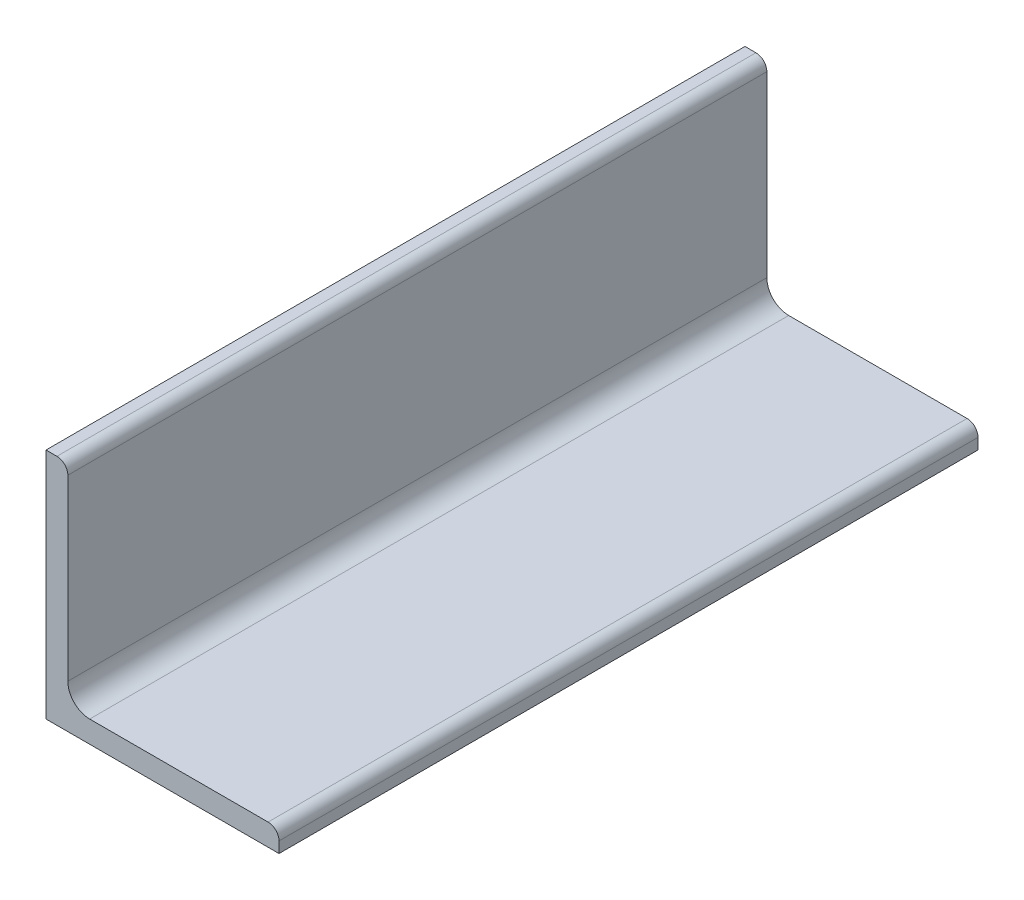
ISO-10303-21;
HEADER;
FILE_DESCRIPTION(('STEP AP214'),'2;1');
FILE_NAME('part.step','',(''),(''),'','','');
FILE_SCHEMA(('AUTOMOTIVE_DESIGN { 1 0 10303 214 1 1 1 1 }'));
ENDSEC;
DATA;
#1=APPLICATION_CONTEXT('core data for automotive mechanical design processes');
#2=APPLICATION_PROTOCOL_DEFINITION('international standard','automotive_design',2000,#1);
#3=PRODUCT_CONTEXT('',#1,'mechanical');
#4=PRODUCT('Part','Part','',(#3));
#5=PRODUCT_RELATED_PRODUCT_CATEGORY('part','',(#4));
#6=PRODUCT_DEFINITION_FORMATION('','',#4);
#7=PRODUCT_DEFINITION_CONTEXT('part definition',#1,'design');
#8=PRODUCT_DEFINITION('design','',#6,#7);
#9=PRODUCT_DEFINITION_SHAPE('','',#8);
#10=(LENGTH_UNIT() NAMED_UNIT(*) SI_UNIT(.MILLI.,.METRE.));
#11=(NAMED_UNIT(*) PLANE_ANGLE_UNIT() SI_UNIT($,.RADIAN.));
#12=(NAMED_UNIT(*) SI_UNIT($,.STERADIAN.) SOLID_ANGLE_UNIT());
#13=UNCERTAINTY_MEASURE_WITH_UNIT(LENGTH_MEASURE(1.E-05),#10,'distance_accuracy_value','');
#14=(GEOMETRIC_REPRESENTATION_CONTEXT(3) GLOBAL_UNCERTAINTY_ASSIGNED_CONTEXT((#13)) GLOBAL_UNIT_ASSIGNED_CONTEXT((#10,
#11,#12)) REPRESENTATION_CONTEXT('',''));
#15=CARTESIAN_POINT('',(0.,0.,0.));
#16=DIRECTION('',(0.,0.,1.));
#17=DIRECTION('',(1.,0.,0.));
#18=AXIS2_PLACEMENT_3D('',#15,#16,#17);
#19=CARTESIAN_POINT('',(0.865045893659089,102.172018782971,304.8));
#20=DIRECTION('',(1.,0.,0.));
#21=DIRECTION('',(0.,0.,-1.));
#22=AXIS2_PLACEMENT_3D('',#19,#20,#21);
#23=PLANE('',#22);
#24=DIRECTION('',(0.,-1.,0.));
#25=VECTOR('',#24,1.);
#26=CARTESIAN_POINT('',(0.865045893659089,102.172018782971,0.));
#27=LINE('',#26,#25);
#28=CARTESIAN_POINT('',(0.865045893659089,102.172018782971,0.));
#29=VERTEX_POINT('',#28);
#30=CARTESIAN_POINT('',(0.865045893659089,0.572018782971054,0.));
#31=VERTEX_POINT('',#30);
#32=EDGE_CURVE('E135',#29,#31,#27,.T.);
#33=ORIENTED_EDGE('',*,*,#32,.T.);
#34=DIRECTION('',(0.,0.,-1.));
#35=VECTOR('',#34,1.);
#36=CARTESIAN_POINT('',(0.865045893659089,0.572018782971054,304.8));
#37=LINE('',#36,#35);
#38=CARTESIAN_POINT('',(0.865045893659089,0.572018782971054,304.8));
#39=VERTEX_POINT('',#38);
#40=EDGE_CURVE('E11',#39,#31,#37,.T.);
#41=ORIENTED_EDGE('',*,*,#40,.F.);
#42=DIRECTION('',(0.,-1.,0.));
#43=VECTOR('',#42,1.);
#44=CARTESIAN_POINT('',(0.865045893659089,102.172018782971,304.8));
#45=LINE('',#44,#43);
#46=CARTESIAN_POINT('',(0.865045893659089,102.172018782971,304.8));
#47=VERTEX_POINT('',#46);
#48=EDGE_CURVE('E151',#47,#39,#45,.T.);
#49=ORIENTED_EDGE('',*,*,#48,.F.);
#50=DIRECTION('',(0.,0.,-1.));
#51=VECTOR('',#50,1.);
#52=CARTESIAN_POINT('',(0.865045893659089,102.172018782971,304.8));
#53=LINE('',#52,#51);
#54=EDGE_CURVE('E131',#47,#29,#53,.T.);
#55=ORIENTED_EDGE('',*,*,#54,.T.);
#56=EDGE_LOOP('',(#33,#41,#49,#55));
#57=FACE_BOUND('',#56,.T.);
#58=ADVANCED_FACE('F33',(#57),#23,.F.);
#59=CARTESIAN_POINT('',(0.865045893659089,0.572018782971054,304.8));
#60=DIRECTION('',(0.,1.,0.));
#61=DIRECTION('',(0.,0.,1.));
#62=AXIS2_PLACEMENT_3D('',#59,#60,#61);
#63=PLANE('',#62);
#64=DIRECTION('',(1.,0.,0.));
#65=VECTOR('',#64,1.);
#66=CARTESIAN_POINT('',(0.865045893659089,0.572018782971054,0.));
#67=LINE('',#66,#65);
#68=CARTESIAN_POINT('',(102.465045893659,0.572018782971054,0.));
#69=VERTEX_POINT('',#68);
#70=EDGE_CURVE('E138',#31,#69,#67,.T.);
#71=ORIENTED_EDGE('',*,*,#70,.T.);
#72=DIRECTION('',(0.,0.,-1.));
#73=VECTOR('',#72,1.);
#74=CARTESIAN_POINT('',(102.465045893659,0.572018782971054,304.8));
#75=LINE('',#74,#73);
#76=CARTESIAN_POINT('',(102.465045893659,0.572018782971054,304.8));
#77=VERTEX_POINT('',#76);
#78=EDGE_CURVE('E41',#77,#69,#75,.T.);
#79=ORIENTED_EDGE('',*,*,#78,.F.);
#80=DIRECTION('',(1.,0.,0.));
#81=VECTOR('',#80,1.);
#82=CARTESIAN_POINT('',(0.865045893659089,0.572018782971054,304.8));
#83=LINE('',#82,#81);
#84=EDGE_CURVE('E95',#39,#77,#83,.T.);
#85=ORIENTED_EDGE('',*,*,#84,.F.);
#86=ORIENTED_EDGE('',*,*,#40,.T.);
#87=EDGE_LOOP('',(#71,#79,#85,#86));
#88=FACE_BOUND('',#87,.T.);
#89=ADVANCED_FACE('F194',(#88),#63,.F.);
#90=CARTESIAN_POINT('',(102.465045893659,0.572018782971054,304.8));
#91=DIRECTION('',(-1.,0.,0.));
#92=DIRECTION('',(0.,0.,1.));
#93=AXIS2_PLACEMENT_3D('',#90,#91,#92);
#94=PLANE('',#93);
#95=DIRECTION('',(0.,1.,0.));
#96=VECTOR('',#95,1.);
#97=CARTESIAN_POINT('',(102.465045893659,0.572018782971054,0.));
#98=LINE('',#97,#96);
#99=CARTESIAN_POINT('',(102.465045893659,5.33451878297105,0.));
#100=VERTEX_POINT('',#99);
#101=EDGE_CURVE('E140',#69,#100,#98,.T.);
#102=ORIENTED_EDGE('',*,*,#101,.T.);
#103=DIRECTION('',(0.,0.,-1.));
#104=VECTOR('',#103,1.);
#105=CARTESIAN_POINT('',(102.465045893659,5.33451878297105,304.8));
#106=LINE('',#105,#104);
#107=CARTESIAN_POINT('',(102.465045893659,5.33451878297105,304.8));
#108=VERTEX_POINT('',#107);
#109=EDGE_CURVE('E161',#108,#100,#106,.T.);
#110=ORIENTED_EDGE('',*,*,#109,.F.);
#111=DIRECTION('',(0.,1.,0.));
#112=VECTOR('',#111,1.);
#113=CARTESIAN_POINT('',(102.465045893659,0.572018782971054,304.8));
#114=LINE('',#113,#112);
#115=EDGE_CURVE('E169',#77,#108,#114,.T.);
#116=ORIENTED_EDGE('',*,*,#115,.F.);
#117=ORIENTED_EDGE('',*,*,#78,.T.);
#118=EDGE_LOOP('',(#102,#110,#116,#117));
#119=FACE_BOUND('',#118,.T.);
#120=ADVANCED_FACE('F167',(#119),#94,.F.);
#121=CARTESIAN_POINT('',(97.7025458936591,5.33451878297105,304.8));
#122=DIRECTION('',(0.,0.,-1.));
#123=DIRECTION('',(-1.,0.,0.));
#124=AXIS2_PLACEMENT_3D('',#121,#122,#123);
#125=CYLINDRICAL_SURFACE('',#124,4.7625);
#126=CARTESIAN_POINT('',(97.7025458936591,5.33451878297105,0.));
#127=DIRECTION('',(0.,0.,1.));
#128=DIRECTION('',(1.,0.,0.));
#129=AXIS2_PLACEMENT_3D('',#126,#127,#128);
#130=CIRCLE('',#129,4.7625);
#131=CARTESIAN_POINT('',(97.7025458936591,10.0970187829711,0.));
#132=VERTEX_POINT('',#131);
#133=EDGE_CURVE('E142',#100,#132,#130,.T.);
#134=ORIENTED_EDGE('',*,*,#133,.T.);
#135=DIRECTION('',(0.,0.,-1.));
#136=VECTOR('',#135,1.);
#137=CARTESIAN_POINT('',(97.7025458936591,10.0970187829711,304.8));
#138=LINE('',#137,#136);
#139=CARTESIAN_POINT('',(97.7025458936591,10.0970187829711,304.8));
#140=VERTEX_POINT('',#139);
#141=EDGE_CURVE('E158',#140,#132,#138,.T.);
#142=ORIENTED_EDGE('',*,*,#141,.F.);
#143=CARTESIAN_POINT('',(97.7025458936591,5.33451878297105,304.8));
#144=DIRECTION('',(0.,0.,1.));
#145=DIRECTION('',(1.,0.,0.));
#146=AXIS2_PLACEMENT_3D('',#143,#144,#145);
#147=CIRCLE('',#146,4.7625);
#148=EDGE_CURVE('E185',#108,#140,#147,.T.);
#149=ORIENTED_EDGE('',*,*,#148,.F.);
#150=ORIENTED_EDGE('',*,*,#109,.T.);
#151=EDGE_LOOP('',(#134,#142,#149,#150));
#152=FACE_BOUND('',#151,.T.);
#153=ADVANCED_FACE('F178',(#152),#125,.T.);
#154=CARTESIAN_POINT('',(97.7025458936591,10.0970187829711,304.8));
#155=DIRECTION('',(0.,-1.,0.));
#156=DIRECTION('',(0.,0.,-1.));
#157=AXIS2_PLACEMENT_3D('',#154,#155,#156);
#158=PLANE('',#157);
#159=DIRECTION('',(-1.,0.,0.));
#160=VECTOR('',#159,1.);
#161=CARTESIAN_POINT('',(97.7025458936591,10.0970187829711,0.));
#162=LINE('',#161,#160);
#163=CARTESIAN_POINT('',(19.9150458936591,10.0970187829711,0.));
#164=VERTEX_POINT('',#163);
#165=EDGE_CURVE('E144',#132,#164,#162,.T.);
#166=ORIENTED_EDGE('',*,*,#165,.T.);
#167=DIRECTION('',(0.,0.,-1.));
#168=VECTOR('',#167,1.);
#169=CARTESIAN_POINT('',(19.9150458936591,10.0970187829711,304.8));
#170=LINE('',#169,#168);
#171=CARTESIAN_POINT('',(19.9150458936591,10.0970187829711,304.8));
#172=VERTEX_POINT('',#171);
#173=EDGE_CURVE('E155',#172,#164,#170,.T.);
#174=ORIENTED_EDGE('',*,*,#173,.F.);
#175=DIRECTION('',(-1.,0.,0.));
#176=VECTOR('',#175,1.);
#177=CARTESIAN_POINT('',(97.7025458936591,10.0970187829711,304.8));
#178=LINE('',#177,#176);
#179=EDGE_CURVE('E184',#140,#172,#178,.T.);
#180=ORIENTED_EDGE('',*,*,#179,.F.);
#181=ORIENTED_EDGE('',*,*,#141,.T.);
#182=EDGE_LOOP('',(#166,#174,#180,#181));
#183=FACE_BOUND('',#182,.T.);
#184=ADVANCED_FACE('F182',(#183),#158,.F.);
#185=CARTESIAN_POINT('',(19.9150458936591,19.622018782971,304.8));
#186=DIRECTION('',(0.,0.,-1.));
#187=DIRECTION('',(-1.,0.,0.));
#188=AXIS2_PLACEMENT_3D('',#185,#186,#187);
#189=CYLINDRICAL_SURFACE('',#188,9.52499999999999);
#190=CARTESIAN_POINT('',(19.9150458936591,19.622018782971,0.));
#191=DIRECTION('',(0.,0.,-1.));
#192=DIRECTION('',(1.,0.,0.));
#193=AXIS2_PLACEMENT_3D('',#190,#191,#192);
#194=CIRCLE('',#193,9.52499999999999);
#195=CARTESIAN_POINT('',(10.3900458936591,19.6220187829711,0.));
#196=VERTEX_POINT('',#195);
#197=EDGE_CURVE('E146',#164,#196,#194,.T.);
#198=ORIENTED_EDGE('',*,*,#197,.T.);
#199=DIRECTION('',(0.,0.,-1.));
#200=VECTOR('',#199,1.);
#201=CARTESIAN_POINT('',(10.3900458936591,19.6220187829711,304.8));
#202=LINE('',#201,#200);
#203=CARTESIAN_POINT('',(10.3900458936591,19.6220187829711,304.8));
#204=VERTEX_POINT('',#203);
#205=EDGE_CURVE('E126',#204,#196,#202,.T.);
#206=ORIENTED_EDGE('',*,*,#205,.F.);
#207=CARTESIAN_POINT('',(19.9150458936591,19.622018782971,304.8));
#208=DIRECTION('',(0.,0.,-1.));
#209=DIRECTION('',(1.,0.,0.));
#210=AXIS2_PLACEMENT_3D('',#207,#208,#209);
#211=CIRCLE('',#210,9.52499999999999);
#212=EDGE_CURVE('E117',#172,#204,#211,.T.);
#213=ORIENTED_EDGE('',*,*,#212,.F.);
#214=ORIENTED_EDGE('',*,*,#173,.T.);
#215=EDGE_LOOP('',(#198,#206,#213,#214));
#216=FACE_BOUND('',#215,.T.);
#217=ADVANCED_FACE('F206',(#216),#189,.F.);
#218=CARTESIAN_POINT('',(10.3900458936591,19.6220187829711,304.8));
#219=DIRECTION('',(-1.,0.,0.));
#220=DIRECTION('',(0.,0.,1.));
#221=AXIS2_PLACEMENT_3D('',#218,#219,#220);
#222=PLANE('',#221);
#223=DIRECTION('',(0.,1.,0.));
#224=VECTOR('',#223,1.);
#225=CARTESIAN_POINT('',(10.3900458936591,19.6220187829711,0.));
#226=LINE('',#225,#224);
#227=CARTESIAN_POINT('',(10.3900458936591,97.409518782971,0.));
#228=VERTEX_POINT('',#227);
#229=EDGE_CURVE('E125',#196,#228,#226,.T.);
#230=ORIENTED_EDGE('',*,*,#229,.T.);
#231=DIRECTION('',(0.,0.,-1.));
#232=VECTOR('',#231,1.);
#233=CARTESIAN_POINT('',(10.3900458936591,97.409518782971,304.8));
#234=LINE('',#233,#232);
#235=CARTESIAN_POINT('',(10.3900458936591,97.409518782971,304.8));
#236=VERTEX_POINT('',#235);
#237=EDGE_CURVE('E122',#236,#228,#234,.T.);
#238=ORIENTED_EDGE('',*,*,#237,.F.);
#239=DIRECTION('',(0.,1.,0.));
#240=VECTOR('',#239,1.);
#241=CARTESIAN_POINT('',(10.3900458936591,19.6220187829711,304.8));
#242=LINE('',#241,#240);
#243=EDGE_CURVE('E111',#204,#236,#242,.T.);
#244=ORIENTED_EDGE('',*,*,#243,.F.);
#245=ORIENTED_EDGE('',*,*,#205,.T.);
#246=EDGE_LOOP('',(#230,#238,#244,#245));
#247=FACE_BOUND('',#246,.T.);
#248=ADVANCED_FACE('F123',(#247),#222,.F.);
#249=CARTESIAN_POINT('',(5.62754589365909,97.409518782971,304.8));
#250=DIRECTION('',(0.,0.,-1.));
#251=DIRECTION('',(-1.,0.,0.));
#252=AXIS2_PLACEMENT_3D('',#249,#250,#251);
#253=CYLINDRICAL_SURFACE('',#252,4.7625);
#254=CARTESIAN_POINT('',(5.62754589365909,97.409518782971,0.));
#255=DIRECTION('',(0.,0.,1.));
#256=DIRECTION('',(1.,0.,0.));
#257=AXIS2_PLACEMENT_3D('',#254,#255,#256);
#258=CIRCLE('',#257,4.7625);
#259=CARTESIAN_POINT('',(5.62754589365909,102.172018782971,0.));
#260=VERTEX_POINT('',#259);
#261=EDGE_CURVE('E81',#228,#260,#258,.T.);
#262=ORIENTED_EDGE('',*,*,#261,.T.);
#263=DIRECTION('',(0.,0.,-1.));
#264=VECTOR('',#263,1.);
#265=CARTESIAN_POINT('',(5.62754589365909,102.172018782971,304.8));
#266=LINE('',#265,#264);
#267=CARTESIAN_POINT('',(5.62754589365909,102.172018782971,304.8));
#268=VERTEX_POINT('',#267);
#269=EDGE_CURVE('E127',#268,#260,#266,.T.);
#270=ORIENTED_EDGE('',*,*,#269,.F.);
#271=CARTESIAN_POINT('',(5.62754589365909,97.409518782971,304.8));
#272=DIRECTION('',(0.,0.,1.));
#273=DIRECTION('',(1.,0.,0.));
#274=AXIS2_PLACEMENT_3D('',#271,#272,#273);
#275=CIRCLE('',#274,4.7625);
#276=EDGE_CURVE('E115',#236,#268,#275,.T.);
#277=ORIENTED_EDGE('',*,*,#276,.F.);
#278=ORIENTED_EDGE('',*,*,#237,.T.);
#279=EDGE_LOOP('',(#262,#270,#277,#278));
#280=FACE_BOUND('',#279,.T.);
#281=ADVANCED_FACE('F129',(#280),#253,.T.);
#282=CARTESIAN_POINT('',(5.62754589365909,102.172018782971,304.8));
#283=DIRECTION('',(0.,-1.,0.));
#284=DIRECTION('',(0.,0.,-1.));
#285=AXIS2_PLACEMENT_3D('',#282,#283,#284);
#286=PLANE('',#285);
#287=DIRECTION('',(-1.,0.,0.));
#288=VECTOR('',#287,1.);
#289=CARTESIAN_POINT('',(5.62754589365909,102.172018782971,0.));
#290=LINE('',#289,#288);
#291=EDGE_CURVE('E87',#260,#29,#290,.T.);
#292=ORIENTED_EDGE('',*,*,#291,.T.);
#293=ORIENTED_EDGE('',*,*,#54,.F.);
#294=DIRECTION('',(-1.,0.,0.));
#295=VECTOR('',#294,1.);
#296=CARTESIAN_POINT('',(5.62754589365909,102.172018782971,304.8));
#297=LINE('',#296,#295);
#298=EDGE_CURVE('E49',#268,#47,#297,.T.);
#299=ORIENTED_EDGE('',*,*,#298,.F.);
#300=ORIENTED_EDGE('',*,*,#269,.T.);
#301=EDGE_LOOP('',(#292,#293,#299,#300));
#302=FACE_BOUND('',#301,.T.);
#303=ADVANCED_FACE('F214',(#302),#286,.F.);
#304=CARTESIAN_POINT('',(97.7025458936591,5.33451878297105,304.8));
#305=DIRECTION('',(0.,0.,1.));
#306=DIRECTION('',(1.,0.,0.));
#307=AXIS2_PLACEMENT_3D('',#304,#305,#306);
#308=PLANE('',#307);
#309=ORIENTED_EDGE('',*,*,#48,.T.);
#310=ORIENTED_EDGE('',*,*,#84,.T.);
#311=ORIENTED_EDGE('',*,*,#115,.T.);
#312=ORIENTED_EDGE('',*,*,#148,.T.);
#313=ORIENTED_EDGE('',*,*,#179,.T.);
#314=ORIENTED_EDGE('',*,*,#212,.T.);
#315=ORIENTED_EDGE('',*,*,#243,.T.);
#316=ORIENTED_EDGE('',*,*,#276,.T.);
#317=ORIENTED_EDGE('',*,*,#298,.T.);
#318=EDGE_LOOP('',(#309,#310,#311,#312,#313,#314,#315,#316,#317));
#319=FACE_BOUND('',#318,.T.);
#320=ADVANCED_FACE('F113',(#319),#308,.T.);
#321=CARTESIAN_POINT('',(97.7025458936591,5.33451878297105,0.));
#322=DIRECTION('',(0.,0.,1.));
#323=DIRECTION('',(1.,0.,0.));
#324=AXIS2_PLACEMENT_3D('',#321,#322,#323);
#325=PLANE('',#324);
#326=ORIENTED_EDGE('',*,*,#32,.F.);
#327=ORIENTED_EDGE('',*,*,#291,.F.);
#328=ORIENTED_EDGE('',*,*,#261,.F.);
#329=ORIENTED_EDGE('',*,*,#229,.F.);
#330=ORIENTED_EDGE('',*,*,#197,.F.);
#331=ORIENTED_EDGE('',*,*,#165,.F.);
#332=ORIENTED_EDGE('',*,*,#133,.F.);
#333=ORIENTED_EDGE('',*,*,#101,.F.);
#334=ORIENTED_EDGE('',*,*,#70,.F.);
#335=EDGE_LOOP('',(#326,#327,#328,#329,#330,#331,#332,#333,#334));
#336=FACE_BOUND('',#335,.T.);
#337=ADVANCED_FACE('F173',(#336),#325,.F.);
#338=CLOSED_SHELL('',(#58,#89,#120,#153,#184,#217,#248,#281,#303,#320,#337));
#339=MANIFOLD_SOLID_BREP('B2',#338);
#340=ADVANCED_BREP_SHAPE_REPRESENTATION('',(#18,#339),#14);
#341=SHAPE_DEFINITION_REPRESENTATION(#9,#340);
ENDSEC;
END-ISO-10303-21;
